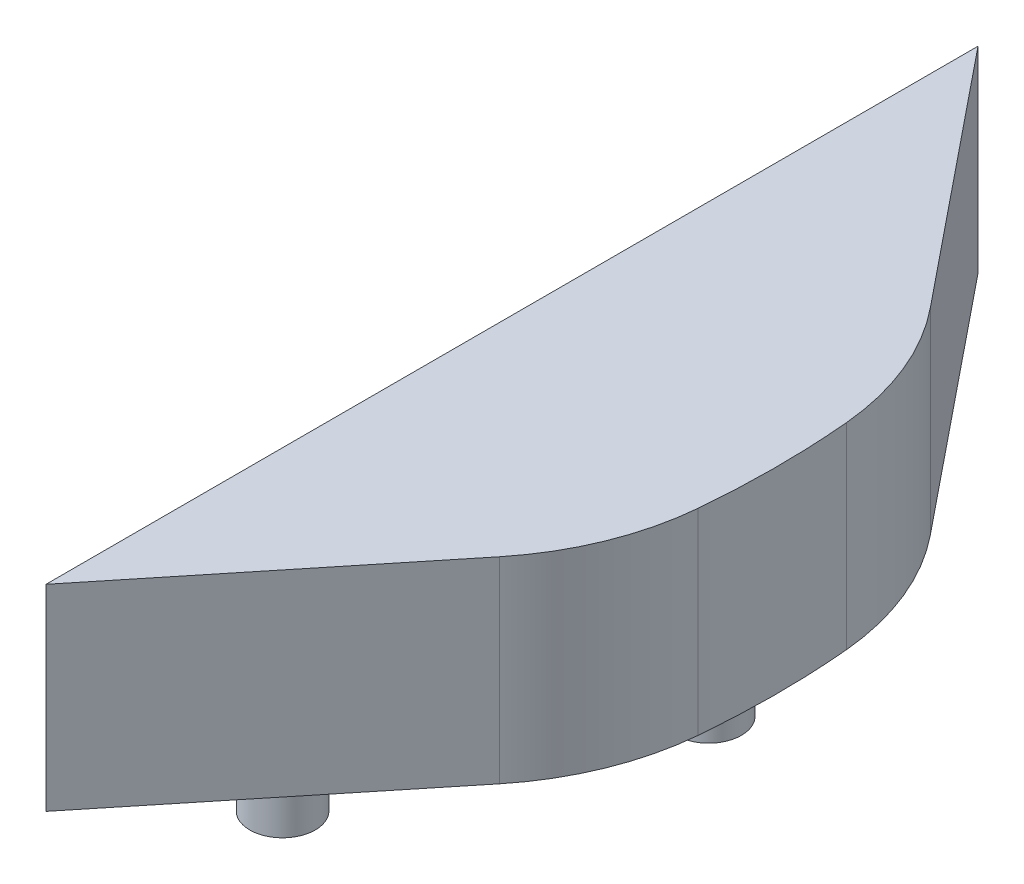
ISO-10303-21;
HEADER;
FILE_DESCRIPTION(('STEP AP214'),'2;1');
FILE_NAME('part.step','',(''),(''),'','','');
FILE_SCHEMA(('AUTOMOTIVE_DESIGN { 1 0 10303 214 1 1 1 1 }'));
ENDSEC;
DATA;
#1=APPLICATION_CONTEXT('core data for automotive mechanical design processes');
#2=APPLICATION_PROTOCOL_DEFINITION('international standard','automotive_design',2000,#1);
#3=PRODUCT_CONTEXT('',#1,'mechanical');
#4=PRODUCT('Part','Part','',(#3));
#5=PRODUCT_RELATED_PRODUCT_CATEGORY('part','',(#4));
#6=PRODUCT_DEFINITION_FORMATION('','',#4);
#7=PRODUCT_DEFINITION_CONTEXT('part definition',#1,'design');
#8=PRODUCT_DEFINITION('design','',#6,#7);
#9=PRODUCT_DEFINITION_SHAPE('','',#8);
#10=(LENGTH_UNIT() NAMED_UNIT(*) SI_UNIT(.MILLI.,.METRE.));
#11=(NAMED_UNIT(*) PLANE_ANGLE_UNIT() SI_UNIT($,.RADIAN.));
#12=(NAMED_UNIT(*) SI_UNIT($,.STERADIAN.) SOLID_ANGLE_UNIT());
#13=UNCERTAINTY_MEASURE_WITH_UNIT(LENGTH_MEASURE(1.E-05),#10,'distance_accuracy_value','');
#14=(GEOMETRIC_REPRESENTATION_CONTEXT(3) GLOBAL_UNCERTAINTY_ASSIGNED_CONTEXT((#13)) GLOBAL_UNIT_ASSIGNED_CONTEXT((#10,
#11,#12)) REPRESENTATION_CONTEXT('',''));
#15=CARTESIAN_POINT('',(0.,0.,0.));
#16=DIRECTION('',(0.,0.,1.));
#17=DIRECTION('',(1.,0.,0.));
#18=AXIS2_PLACEMENT_3D('',#15,#16,#17);
#19=CARTESIAN_POINT('',(0.,38.1,0.));
#20=DIRECTION('',(0.,1.,0.));
#21=DIRECTION('',(0.,0.,-1.));
#22=AXIS2_PLACEMENT_3D('',#19,#20,#21);
#23=ELLIPSE('',#22,90.2726223006596,51.0637220349821);
#24=DIRECTION('',(0.,-1.,0.));
#25=VECTOR('',#24,1.);
#26=SURFACE_OF_LINEAR_EXTRUSION('',#23,#25);
#27=CARTESIAN_POINT('',(0.,0.,0.));
#28=DIRECTION('',(0.,1.,0.));
#29=DIRECTION('',(0.,0.,-1.));
#30=AXIS2_PLACEMENT_3D('',#27,#28,#29);
#31=ELLIPSE('',#30,90.2726223006596,51.0637220349821);
#32=CARTESIAN_POINT('',(50.4120122549604,0.,14.3764550720096));
#33=VERTEX_POINT('',#32);
#34=CARTESIAN_POINT('',(50.4120122549604,0.,-14.3764550720095));
#35=VERTEX_POINT('',#34);
#36=EDGE_CURVE('E114',#33,#35,#31,.T.);
#37=ORIENTED_EDGE('',*,*,#36,.T.);
#38=DIRECTION('',(0.,-1.,0.));
#39=VECTOR('',#38,1.);
#40=CARTESIAN_POINT('',(50.4120122549604,0.,-14.3764550720095));
#41=LINE('',#40,#39);
#42=CARTESIAN_POINT('',(50.4120122549604,38.1,-14.3764550720095));
#43=VERTEX_POINT('',#42);
#44=EDGE_CURVE('E60',#35,#43,#41,.F.);
#45=ORIENTED_EDGE('',*,*,#44,.T.);
#46=CARTESIAN_POINT('',(50.4120122549604,38.1,14.3764550720096));
#47=VERTEX_POINT('',#46);
#48=EDGE_CURVE('E113',#47,#43,#23,.T.);
#49=ORIENTED_EDGE('',*,*,#48,.F.);
#50=DIRECTION('',(0.,-1.,0.));
#51=VECTOR('',#50,1.);
#52=CARTESIAN_POINT('',(50.4120122549604,38.1,14.3764550720095));
#53=LINE('',#52,#51);
#54=EDGE_CURVE('E146',#47,#33,#53,.T.);
#55=ORIENTED_EDGE('',*,*,#54,.T.);
#56=EDGE_LOOP('',(#37,#45,#49,#55));
#57=FACE_BOUND('',#56,.T.);
#58=ADVANCED_FACE('F38',(#57),#26,.F.);
#59=CARTESIAN_POINT('',(0.,38.1,-90.2726223006596));
#60=DIRECTION('',(1.,0.,0.));
#61=DIRECTION('',(0.,0.,-1.));
#62=AXIS2_PLACEMENT_3D('',#59,#60,#61);
#63=PLANE('',#62);
#64=DIRECTION('',(0.,0.,1.));
#65=VECTOR('',#64,1.);
#66=CARTESIAN_POINT('',(0.,0.,-90.2726223006596));
#67=LINE('',#66,#65);
#68=CARTESIAN_POINT('',(0.,0.,-90.2726223006596));
#69=VERTEX_POINT('',#68);
#70=CARTESIAN_POINT('',(0.,0.,90.2726223006596));
#71=VERTEX_POINT('',#70);
#72=EDGE_CURVE('E108',#69,#71,#67,.T.);
#73=ORIENTED_EDGE('',*,*,#72,.T.);
#74=DIRECTION('',(0.,-1.,0.));
#75=VECTOR('',#74,1.);
#76=CARTESIAN_POINT('',(0.,38.1,90.2726223006596));
#77=LINE('',#76,#75);
#78=CARTESIAN_POINT('',(0.,38.1,90.2726223006596));
#79=VERTEX_POINT('',#78);
#80=EDGE_CURVE('E122',#79,#71,#77,.T.);
#81=ORIENTED_EDGE('',*,*,#80,.F.);
#82=DIRECTION('',(0.,0.,1.));
#83=VECTOR('',#82,1.);
#84=CARTESIAN_POINT('',(0.,38.1,-90.2726223006596));
#85=LINE('',#84,#83);
#86=CARTESIAN_POINT('',(0.,38.1,-90.2726223006596));
#87=VERTEX_POINT('',#86);
#88=EDGE_CURVE('E119',#87,#79,#85,.T.);
#89=ORIENTED_EDGE('',*,*,#88,.F.);
#90=DIRECTION('',(0.,-1.,0.));
#91=VECTOR('',#90,1.);
#92=CARTESIAN_POINT('',(0.,38.1,-90.2726223006596));
#93=LINE('',#92,#91);
#94=EDGE_CURVE('E98',#87,#69,#93,.T.);
#95=ORIENTED_EDGE('',*,*,#94,.T.);
#96=EDGE_LOOP('',(#73,#81,#89,#95));
#97=FACE_BOUND('',#96,.T.);
#98=ADVANCED_FACE('F117',(#97),#63,.F.);
#99=CARTESIAN_POINT('',(0.,38.1,0.));
#100=DIRECTION('',(0.,1.,0.));
#101=DIRECTION('',(0.,0.,1.));
#102=AXIS2_PLACEMENT_3D('',#99,#100,#101);
#103=PLANE('',#102);
#104=ORIENTED_EDGE('',*,*,#48,.T.);
#105=CARTESIAN_POINT('',(-0.177806917153077,38.1,-9.76015827339884));
#106=DIRECTION('',(0.,1.,0.));
#107=DIRECTION('',(0.,0.,1.));
#108=AXIS2_PLACEMENT_3D('',#105,#106,#107);
#109=CIRCLE('',#108,50.8);
#110=CARTESIAN_POINT('',(39.3044411196748,38.1,-41.7256410627828));
#111=VERTEX_POINT('',#110);
#112=EDGE_CURVE('E47',#43,#111,#109,.T.);
#113=ORIENTED_EDGE('',*,*,#112,.T.);
#114=DIRECTION('',(0.629241787192597,0.,0.777209607024171));
#115=VECTOR('',#114,1.);
#116=CARTESIAN_POINT('',(44.1480752824036,38.1,-35.7430139060916));
#117=LINE('',#116,#115);
#118=EDGE_CURVE('E158',#87,#111,#117,.T.);
#119=ORIENTED_EDGE('',*,*,#118,.F.);
#120=ORIENTED_EDGE('',*,*,#88,.T.);
#121=DIRECTION('',(-0.629241787192597,0.,0.777209607024171));
#122=VECTOR('',#121,1.);
#123=CARTESIAN_POINT('',(44.1480752824036,38.1,35.7430139060916));
#124=LINE('',#123,#122);
#125=CARTESIAN_POINT('',(39.3044411196748,38.1,41.7256410627827));
#126=VERTEX_POINT('',#125);
#127=EDGE_CURVE('E161',#126,#79,#124,.T.);
#128=ORIENTED_EDGE('',*,*,#127,.F.);
#129=CARTESIAN_POINT('',(-0.177806917153085,38.1,9.76015827339881));
#130=DIRECTION('',(0.,1.,0.));
#131=DIRECTION('',(0.,0.,1.));
#132=AXIS2_PLACEMENT_3D('',#129,#130,#131);
#133=CIRCLE('',#132,50.8);
#134=EDGE_CURVE('E152',#126,#47,#133,.T.);
#135=ORIENTED_EDGE('',*,*,#134,.T.);
#136=EDGE_LOOP('',(#104,#113,#119,#120,#128,#135));
#137=FACE_BOUND('',#136,.T.);
#138=ADVANCED_FACE('F157',(#137),#103,.T.);
#139=CARTESIAN_POINT('',(0.,0.,0.));
#140=DIRECTION('',(0.,1.,0.));
#141=DIRECTION('',(0.,0.,1.));
#142=AXIS2_PLACEMENT_3D('',#139,#140,#141);
#143=PLANE('',#142);
#144=CARTESIAN_POINT('',(38.1,0.,0.));
#145=DIRECTION('',(0.,1.,0.));
#146=DIRECTION('',(0.,0.,1.));
#147=AXIS2_PLACEMENT_3D('',#144,#145,#146);
#148=CIRCLE('',#147,6.35);
#149=CARTESIAN_POINT('',(38.1,0.,6.35));
#150=VERTEX_POINT('',#149);
#151=EDGE_CURVE('E134',#150,#150,#148,.F.);
#152=ORIENTED_EDGE('',*,*,#151,.F.);
#153=EDGE_LOOP('',(#152));
#154=FACE_BOUND('',#153,.T.);
#155=CARTESIAN_POINT('',(12.7,0.,-57.15));
#156=DIRECTION('',(0.,1.,0.));
#157=DIRECTION('',(0.,0.,1.));
#158=AXIS2_PLACEMENT_3D('',#155,#156,#157);
#159=CIRCLE('',#158,6.35);
#160=CARTESIAN_POINT('',(12.7,0.,-50.8));
#161=VERTEX_POINT('',#160);
#162=EDGE_CURVE('E127',#161,#161,#159,.F.);
#163=ORIENTED_EDGE('',*,*,#162,.F.);
#164=EDGE_LOOP('',(#163));
#165=FACE_BOUND('',#164,.T.);
#166=CARTESIAN_POINT('',(12.7,0.,57.15));
#167=DIRECTION('',(0.,1.,0.));
#168=DIRECTION('',(0.,0.,1.));
#169=AXIS2_PLACEMENT_3D('',#166,#167,#168);
#170=CIRCLE('',#169,6.35);
#171=CARTESIAN_POINT('',(12.7,0.,63.5));
#172=VERTEX_POINT('',#171);
#173=EDGE_CURVE('E121',#172,#172,#170,.F.);
#174=ORIENTED_EDGE('',*,*,#173,.F.);
#175=EDGE_LOOP('',(#174));
#176=FACE_BOUND('',#175,.T.);
#177=DIRECTION('',(-0.629241787192597,0.,-0.777209607024171));
#178=VECTOR('',#177,1.);
#179=CARTESIAN_POINT('',(0.,0.,-90.2726223006596));
#180=LINE('',#179,#178);
#181=CARTESIAN_POINT('',(39.3044411196748,0.,-41.7256410627828));
#182=VERTEX_POINT('',#181);
#183=EDGE_CURVE('E93',#182,#69,#180,.T.);
#184=ORIENTED_EDGE('',*,*,#183,.F.);
#185=CARTESIAN_POINT('',(-0.177806917153077,0.,-9.76015827339884));
#186=DIRECTION('',(0.,1.,0.));
#187=DIRECTION('',(0.,0.,1.));
#188=AXIS2_PLACEMENT_3D('',#185,#186,#187);
#189=CIRCLE('',#188,50.8);
#190=EDGE_CURVE('E143',#182,#35,#189,.F.);
#191=ORIENTED_EDGE('',*,*,#190,.T.);
#192=ORIENTED_EDGE('',*,*,#36,.F.);
#193=CARTESIAN_POINT('',(-0.177806917153085,0.,9.76015827339881));
#194=DIRECTION('',(0.,1.,0.));
#195=DIRECTION('',(0.,0.,1.));
#196=AXIS2_PLACEMENT_3D('',#193,#194,#195);
#197=CIRCLE('',#196,50.8);
#198=CARTESIAN_POINT('',(39.3044411196748,0.,41.7256410627828));
#199=VERTEX_POINT('',#198);
#200=EDGE_CURVE('E140',#33,#199,#197,.F.);
#201=ORIENTED_EDGE('',*,*,#200,.T.);
#202=DIRECTION('',(0.629241787192597,0.,-0.777209607024171));
#203=VECTOR('',#202,1.);
#204=CARTESIAN_POINT('',(0.,0.,90.2726223006596));
#205=LINE('',#204,#203);
#206=EDGE_CURVE('E104',#71,#199,#205,.T.);
#207=ORIENTED_EDGE('',*,*,#206,.F.);
#208=ORIENTED_EDGE('',*,*,#72,.F.);
#209=EDGE_LOOP('',(#184,#191,#192,#201,#207,#208));
#210=FACE_BOUND('',#209,.T.);
#211=ADVANCED_FACE('F109',(#154,#165,#176,#210),#143,.F.);
#212=CARTESIAN_POINT('',(12.7,-10.16,57.15));
#213=DIRECTION('',(0.,1.,0.));
#214=DIRECTION('',(0.,0.,1.));
#215=AXIS2_PLACEMENT_3D('',#212,#213,#214);
#216=CYLINDRICAL_SURFACE('',#215,6.35);
#217=CARTESIAN_POINT('',(12.7,-10.16,57.15));
#218=DIRECTION('',(0.,-1.,0.));
#219=DIRECTION('',(0.,0.,-1.));
#220=AXIS2_PLACEMENT_3D('',#217,#218,#219);
#221=CIRCLE('',#220,6.35);
#222=CARTESIAN_POINT('',(12.7,-10.16,50.8));
#223=VERTEX_POINT('',#222);
#224=EDGE_CURVE('E167',#223,#223,#221,.T.);
#225=ORIENTED_EDGE('',*,*,#224,.F.);
#226=EDGE_LOOP('',(#225));
#227=FACE_BOUND('',#226,.T.);
#228=ORIENTED_EDGE('',*,*,#173,.T.);
#229=EDGE_LOOP('',(#228));
#230=FACE_BOUND('',#229,.T.);
#231=ADVANCED_FACE('F215',(#227,#230),#216,.T.);
#232=CARTESIAN_POINT('',(12.7,-10.16,57.15));
#233=DIRECTION('',(0.,-1.,0.));
#234=DIRECTION('',(0.,0.,-1.));
#235=AXIS2_PLACEMENT_3D('',#232,#233,#234);
#236=PLANE('',#235);
#237=ORIENTED_EDGE('',*,*,#224,.T.);
#238=EDGE_LOOP('',(#237));
#239=FACE_BOUND('',#238,.T.);
#240=ADVANCED_FACE('F211',(#239),#236,.T.);
#241=CARTESIAN_POINT('',(12.7,-10.16,-57.15));
#242=DIRECTION('',(0.,1.,0.));
#243=DIRECTION('',(0.,0.,1.));
#244=AXIS2_PLACEMENT_3D('',#241,#242,#243);
#245=CYLINDRICAL_SURFACE('',#244,6.35);
#246=CARTESIAN_POINT('',(12.7,-10.16,-57.15));
#247=DIRECTION('',(0.,-1.,0.));
#248=DIRECTION('',(0.,0.,-1.));
#249=AXIS2_PLACEMENT_3D('',#246,#247,#248);
#250=CIRCLE('',#249,6.35);
#251=CARTESIAN_POINT('',(12.7,-10.16,-63.5));
#252=VERTEX_POINT('',#251);
#253=EDGE_CURVE('E171',#252,#252,#250,.T.);
#254=ORIENTED_EDGE('',*,*,#253,.F.);
#255=EDGE_LOOP('',(#254));
#256=FACE_BOUND('',#255,.T.);
#257=ORIENTED_EDGE('',*,*,#162,.T.);
#258=EDGE_LOOP('',(#257));
#259=FACE_BOUND('',#258,.T.);
#260=ADVANCED_FACE('F207',(#256,#259),#245,.T.);
#261=CARTESIAN_POINT('',(12.7,-10.16,-57.15));
#262=DIRECTION('',(0.,-1.,0.));
#263=DIRECTION('',(0.,0.,-1.));
#264=AXIS2_PLACEMENT_3D('',#261,#262,#263);
#265=PLANE('',#264);
#266=ORIENTED_EDGE('',*,*,#253,.T.);
#267=EDGE_LOOP('',(#266));
#268=FACE_BOUND('',#267,.T.);
#269=ADVANCED_FACE('F203',(#268),#265,.T.);
#270=CARTESIAN_POINT('',(38.1,-10.16,0.));
#271=DIRECTION('',(0.,1.,0.));
#272=DIRECTION('',(0.,0.,1.));
#273=AXIS2_PLACEMENT_3D('',#270,#271,#272);
#274=CYLINDRICAL_SURFACE('',#273,6.35);
#275=CARTESIAN_POINT('',(38.1,-10.16,0.));
#276=DIRECTION('',(0.,-1.,0.));
#277=DIRECTION('',(0.,0.,-1.));
#278=AXIS2_PLACEMENT_3D('',#275,#276,#277);
#279=CIRCLE('',#278,6.35);
#280=CARTESIAN_POINT('',(38.1,-10.16,-6.35));
#281=VERTEX_POINT('',#280);
#282=EDGE_CURVE('E316',#281,#281,#279,.T.);
#283=ORIENTED_EDGE('',*,*,#282,.F.);
#284=EDGE_LOOP('',(#283));
#285=FACE_BOUND('',#284,.T.);
#286=ORIENTED_EDGE('',*,*,#151,.T.);
#287=EDGE_LOOP('',(#286));
#288=FACE_BOUND('',#287,.T.);
#289=ADVANCED_FACE('F199',(#285,#288),#274,.T.);
#290=CARTESIAN_POINT('',(38.1,-10.16,0.));
#291=DIRECTION('',(0.,-1.,0.));
#292=DIRECTION('',(0.,0.,-1.));
#293=AXIS2_PLACEMENT_3D('',#290,#291,#292);
#294=PLANE('',#293);
#295=ORIENTED_EDGE('',*,*,#282,.T.);
#296=EDGE_LOOP('',(#295));
#297=FACE_BOUND('',#296,.T.);
#298=ADVANCED_FACE('F194',(#297),#294,.T.);
#299=CARTESIAN_POINT('',(0.,72.136,-90.2726223006596));
#300=DIRECTION('',(-0.777209607024171,0.,0.629241787192597));
#301=DIRECTION('',(0.629241787192597,0.,0.777209607024171));
#302=AXIS2_PLACEMENT_3D('',#299,#300,#301);
#303=PLANE('',#302);
#304=ORIENTED_EDGE('',*,*,#118,.T.);
#305=DIRECTION('',(0.,-1.,0.));
#306=VECTOR('',#305,1.);
#307=CARTESIAN_POINT('',(39.3044411196748,72.136,-41.7256410627828));
#308=LINE('',#307,#306);
#309=EDGE_CURVE('E101',#111,#182,#308,.T.);
#310=ORIENTED_EDGE('',*,*,#309,.T.);
#311=ORIENTED_EDGE('',*,*,#183,.T.);
#312=ORIENTED_EDGE('',*,*,#94,.F.);
#313=EDGE_LOOP('',(#304,#310,#311,#312));
#314=FACE_BOUND('',#313,.T.);
#315=ADVANCED_FACE('F96',(#314),#303,.F.);
#316=CARTESIAN_POINT('',(0.,72.136,90.2726223006596));
#317=DIRECTION('',(-0.777209607024171,0.,-0.629241787192597));
#318=DIRECTION('',(-0.629241787192597,0.,0.777209607024171));
#319=AXIS2_PLACEMENT_3D('',#316,#317,#318);
#320=PLANE('',#319);
#321=ORIENTED_EDGE('',*,*,#206,.T.);
#322=DIRECTION('',(0.,-1.,0.));
#323=VECTOR('',#322,1.);
#324=CARTESIAN_POINT('',(39.3044411196748,72.136,41.7256410627828));
#325=LINE('',#324,#323);
#326=EDGE_CURVE('E11',#199,#126,#325,.F.);
#327=ORIENTED_EDGE('',*,*,#326,.T.);
#328=ORIENTED_EDGE('',*,*,#127,.T.);
#329=ORIENTED_EDGE('',*,*,#80,.T.);
#330=EDGE_LOOP('',(#321,#327,#328,#329));
#331=FACE_BOUND('',#330,.T.);
#332=ADVANCED_FACE('F184',(#331),#320,.F.);
#333=CARTESIAN_POINT('',(-0.177806917153077,19.05,-9.76015827339884));
#334=DIRECTION('',(0.,-1.,0.));
#335=DIRECTION('',(0.,0.,-1.));
#336=AXIS2_PLACEMENT_3D('',#333,#334,#335);
#337=CYLINDRICAL_SURFACE('',#336,50.8);
#338=ORIENTED_EDGE('',*,*,#112,.F.);
#339=ORIENTED_EDGE('',*,*,#44,.F.);
#340=ORIENTED_EDGE('',*,*,#190,.F.);
#341=ORIENTED_EDGE('',*,*,#309,.F.);
#342=EDGE_LOOP('',(#338,#339,#340,#341));
#343=FACE_BOUND('',#342,.T.);
#344=ADVANCED_FACE('F163',(#343),#337,.T.);
#345=CARTESIAN_POINT('',(-0.177806917153085,19.05,9.76015827339881));
#346=DIRECTION('',(0.,-1.,0.));
#347=DIRECTION('',(0.,0.,-1.));
#348=AXIS2_PLACEMENT_3D('',#345,#346,#347);
#349=CYLINDRICAL_SURFACE('',#348,50.8);
#350=ORIENTED_EDGE('',*,*,#134,.F.);
#351=ORIENTED_EDGE('',*,*,#326,.F.);
#352=ORIENTED_EDGE('',*,*,#200,.F.);
#353=ORIENTED_EDGE('',*,*,#54,.F.);
#354=EDGE_LOOP('',(#350,#351,#352,#353));
#355=FACE_BOUND('',#354,.T.);
#356=ADVANCED_FACE('F40',(#355),#349,.T.);
#357=CLOSED_SHELL('',(#58,#98,#138,#211,#231,#240,#260,#269,#289,#298,#315,#332,#344,#356));
#358=MANIFOLD_SOLID_BREP('B2',#357);
#359=ADVANCED_BREP_SHAPE_REPRESENTATION('',(#18,#358),#14);
#360=SHAPE_DEFINITION_REPRESENTATION(#9,#359);
ENDSEC;
END-ISO-10303-21;
